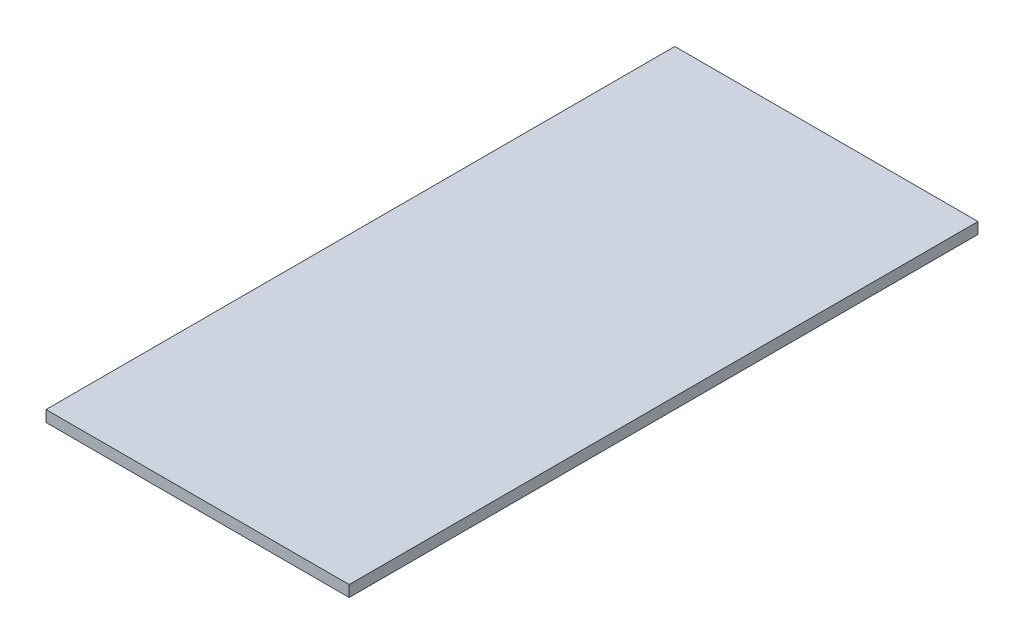
ISO-10303-21;
HEADER;
FILE_DESCRIPTION(('STEP AP214'),'2;1');
FILE_NAME('part.step','',(''),(''),'','','');
FILE_SCHEMA(('AUTOMOTIVE_DESIGN { 1 0 10303 214 1 1 1 1 }'));
ENDSEC;
DATA;
#1=APPLICATION_CONTEXT('core data for automotive mechanical design processes');
#2=APPLICATION_PROTOCOL_DEFINITION('international standard','automotive_design',2000,#1);
#3=PRODUCT_CONTEXT('',#1,'mechanical');
#4=PRODUCT('Part','Part','',(#3));
#5=PRODUCT_RELATED_PRODUCT_CATEGORY('part','',(#4));
#6=PRODUCT_DEFINITION_FORMATION('','',#4);
#7=PRODUCT_DEFINITION_CONTEXT('part definition',#1,'design');
#8=PRODUCT_DEFINITION('design','',#6,#7);
#9=PRODUCT_DEFINITION_SHAPE('','',#8);
#10=(LENGTH_UNIT() NAMED_UNIT(*) SI_UNIT(.MILLI.,.METRE.));
#11=(NAMED_UNIT(*) PLANE_ANGLE_UNIT() SI_UNIT($,.RADIAN.));
#12=(NAMED_UNIT(*) SI_UNIT($,.STERADIAN.) SOLID_ANGLE_UNIT());
#13=UNCERTAINTY_MEASURE_WITH_UNIT(LENGTH_MEASURE(1.E-05),#10,'distance_accuracy_value','');
#14=(GEOMETRIC_REPRESENTATION_CONTEXT(3) GLOBAL_UNCERTAINTY_ASSIGNED_CONTEXT((#13)) GLOBAL_UNIT_ASSIGNED_CONTEXT((#10,
#11,#12)) REPRESENTATION_CONTEXT('',''));
#15=CARTESIAN_POINT('',(0.,0.,0.));
#16=DIRECTION('',(0.,0.,1.));
#17=DIRECTION('',(1.,0.,0.));
#18=AXIS2_PLACEMENT_3D('',#15,#16,#17);
#19=CARTESIAN_POINT('',(257.175,19.05,533.4));
#20=DIRECTION('',(-1.,0.,0.));
#21=DIRECTION('',(0.,0.,1.));
#22=AXIS2_PLACEMENT_3D('',#19,#20,#21);
#23=PLANE('',#22);
#24=DIRECTION('',(0.,0.,-1.));
#25=VECTOR('',#24,1.);
#26=CARTESIAN_POINT('',(257.175,0.,533.4));
#27=LINE('',#26,#25);
#28=CARTESIAN_POINT('',(257.175,0.,533.4));
#29=VERTEX_POINT('',#28);
#30=CARTESIAN_POINT('',(257.175,0.,-533.4));
#31=VERTEX_POINT('',#30);
#32=EDGE_CURVE('E107',#29,#31,#27,.T.);
#33=ORIENTED_EDGE('',*,*,#32,.T.);
#34=DIRECTION('',(0.,-1.,0.));
#35=VECTOR('',#34,1.);
#36=CARTESIAN_POINT('',(257.175,19.05,-533.4));
#37=LINE('',#36,#35);
#38=CARTESIAN_POINT('',(257.175,19.05,-533.4));
#39=VERTEX_POINT('',#38);
#40=EDGE_CURVE('E11',#39,#31,#37,.T.);
#41=ORIENTED_EDGE('',*,*,#40,.F.);
#42=DIRECTION('',(0.,0.,-1.));
#43=VECTOR('',#42,1.);
#44=CARTESIAN_POINT('',(257.175,19.05,533.4));
#45=LINE('',#44,#43);
#46=CARTESIAN_POINT('',(257.175,19.05,533.4));
#47=VERTEX_POINT('',#46);
#48=EDGE_CURVE('E91',#47,#39,#45,.T.);
#49=ORIENTED_EDGE('',*,*,#48,.F.);
#50=DIRECTION('',(0.,-1.,0.));
#51=VECTOR('',#50,1.);
#52=CARTESIAN_POINT('',(257.175,19.05,533.4));
#53=LINE('',#52,#51);
#54=EDGE_CURVE('E103',#47,#29,#53,.T.);
#55=ORIENTED_EDGE('',*,*,#54,.T.);
#56=EDGE_LOOP('',(#33,#41,#49,#55));
#57=FACE_BOUND('',#56,.T.);
#58=ADVANCED_FACE('F39',(#57),#23,.F.);
#59=CARTESIAN_POINT('',(-257.175,19.05,-533.4));
#60=DIRECTION('',(0.,0.,1.));
#61=DIRECTION('',(1.,0.,0.));
#62=AXIS2_PLACEMENT_3D('',#59,#60,#61);
#63=PLANE('',#62);
#64=DIRECTION('',(-1.,0.,0.));
#65=VECTOR('',#64,1.);
#66=CARTESIAN_POINT('',(-257.175,0.,-533.4));
#67=LINE('',#66,#65);
#68=CARTESIAN_POINT('',(-257.175,0.,-533.4));
#69=VERTEX_POINT('',#68);
#70=EDGE_CURVE('E96',#31,#69,#67,.T.);
#71=ORIENTED_EDGE('',*,*,#70,.T.);
#72=DIRECTION('',(0.,-1.,0.));
#73=VECTOR('',#72,1.);
#74=CARTESIAN_POINT('',(-257.175,19.05,-533.4));
#75=LINE('',#74,#73);
#76=CARTESIAN_POINT('',(-257.175,19.05,-533.4));
#77=VERTEX_POINT('',#76);
#78=EDGE_CURVE('E48',#77,#69,#75,.T.);
#79=ORIENTED_EDGE('',*,*,#78,.F.);
#80=DIRECTION('',(-1.,0.,0.));
#81=VECTOR('',#80,1.);
#82=CARTESIAN_POINT('',(-257.175,19.05,-533.4));
#83=LINE('',#82,#81);
#84=EDGE_CURVE('E86',#39,#77,#83,.T.);
#85=ORIENTED_EDGE('',*,*,#84,.F.);
#86=ORIENTED_EDGE('',*,*,#40,.T.);
#87=EDGE_LOOP('',(#71,#79,#85,#86));
#88=FACE_BOUND('',#87,.T.);
#89=ADVANCED_FACE('F95',(#88),#63,.F.);
#90=CARTESIAN_POINT('',(-257.175,19.05,533.4));
#91=DIRECTION('',(1.,0.,0.));
#92=DIRECTION('',(0.,0.,-1.));
#93=AXIS2_PLACEMENT_3D('',#90,#91,#92);
#94=PLANE('',#93);
#95=DIRECTION('',(0.,0.,1.));
#96=VECTOR('',#95,1.);
#97=CARTESIAN_POINT('',(-257.175,0.,533.4));
#98=LINE('',#97,#96);
#99=CARTESIAN_POINT('',(-257.175,0.,533.4));
#100=VERTEX_POINT('',#99);
#101=EDGE_CURVE('E73',#69,#100,#98,.T.);
#102=ORIENTED_EDGE('',*,*,#101,.T.);
#103=DIRECTION('',(0.,-1.,0.));
#104=VECTOR('',#103,1.);
#105=CARTESIAN_POINT('',(-257.175,19.05,533.4));
#106=LINE('',#105,#104);
#107=CARTESIAN_POINT('',(-257.175,19.05,533.4));
#108=VERTEX_POINT('',#107);
#109=EDGE_CURVE('E98',#108,#100,#106,.T.);
#110=ORIENTED_EDGE('',*,*,#109,.F.);
#111=DIRECTION('',(0.,0.,1.));
#112=VECTOR('',#111,1.);
#113=CARTESIAN_POINT('',(-257.175,19.05,533.4));
#114=LINE('',#113,#112);
#115=EDGE_CURVE('E89',#77,#108,#114,.T.);
#116=ORIENTED_EDGE('',*,*,#115,.F.);
#117=ORIENTED_EDGE('',*,*,#78,.T.);
#118=EDGE_LOOP('',(#102,#110,#116,#117));
#119=FACE_BOUND('',#118,.T.);
#120=ADVANCED_FACE('F99',(#119),#94,.F.);
#121=CARTESIAN_POINT('',(-257.175,19.05,533.4));
#122=DIRECTION('',(0.,0.,-1.));
#123=DIRECTION('',(-1.,0.,0.));
#124=AXIS2_PLACEMENT_3D('',#121,#122,#123);
#125=PLANE('',#124);
#126=DIRECTION('',(1.,0.,0.));
#127=VECTOR('',#126,1.);
#128=CARTESIAN_POINT('',(-257.175,0.,533.4));
#129=LINE('',#128,#127);
#130=EDGE_CURVE('E79',#100,#29,#129,.T.);
#131=ORIENTED_EDGE('',*,*,#130,.T.);
#132=ORIENTED_EDGE('',*,*,#54,.F.);
#133=DIRECTION('',(1.,0.,0.));
#134=VECTOR('',#133,1.);
#135=CARTESIAN_POINT('',(-257.175,19.05,533.4));
#136=LINE('',#135,#134);
#137=EDGE_CURVE('E56',#108,#47,#136,.T.);
#138=ORIENTED_EDGE('',*,*,#137,.F.);
#139=ORIENTED_EDGE('',*,*,#109,.T.);
#140=EDGE_LOOP('',(#131,#132,#138,#139));
#141=FACE_BOUND('',#140,.T.);
#142=ADVANCED_FACE('F120',(#141),#125,.F.);
#143=CARTESIAN_POINT('',(0.,19.05,0.));
#144=DIRECTION('',(0.,-1.,0.));
#145=DIRECTION('',(0.,0.,-1.));
#146=AXIS2_PLACEMENT_3D('',#143,#144,#145);
#147=PLANE('',#146);
#148=ORIENTED_EDGE('',*,*,#48,.T.);
#149=ORIENTED_EDGE('',*,*,#84,.T.);
#150=ORIENTED_EDGE('',*,*,#115,.T.);
#151=ORIENTED_EDGE('',*,*,#137,.T.);
#152=EDGE_LOOP('',(#148,#149,#150,#151));
#153=FACE_BOUND('',#152,.T.);
#154=ADVANCED_FACE('F87',(#153),#147,.F.);
#155=CARTESIAN_POINT('',(0.,0.,0.));
#156=DIRECTION('',(0.,-1.,0.));
#157=DIRECTION('',(0.,0.,-1.));
#158=AXIS2_PLACEMENT_3D('',#155,#156,#157);
#159=PLANE('',#158);
#160=ORIENTED_EDGE('',*,*,#32,.F.);
#161=ORIENTED_EDGE('',*,*,#130,.F.);
#162=ORIENTED_EDGE('',*,*,#101,.F.);
#163=ORIENTED_EDGE('',*,*,#70,.F.);
#164=EDGE_LOOP('',(#160,#161,#162,#163));
#165=FACE_BOUND('',#164,.T.);
#166=ADVANCED_FACE('F123',(#165),#159,.T.);
#167=CLOSED_SHELL('',(#58,#89,#120,#142,#154,#166));
#168=MANIFOLD_SOLID_BREP('B2',#167);
#169=ADVANCED_BREP_SHAPE_REPRESENTATION('',(#18,#168),#14);
#170=SHAPE_DEFINITION_REPRESENTATION(#9,#169);
ENDSEC;
END-ISO-10303-21;
